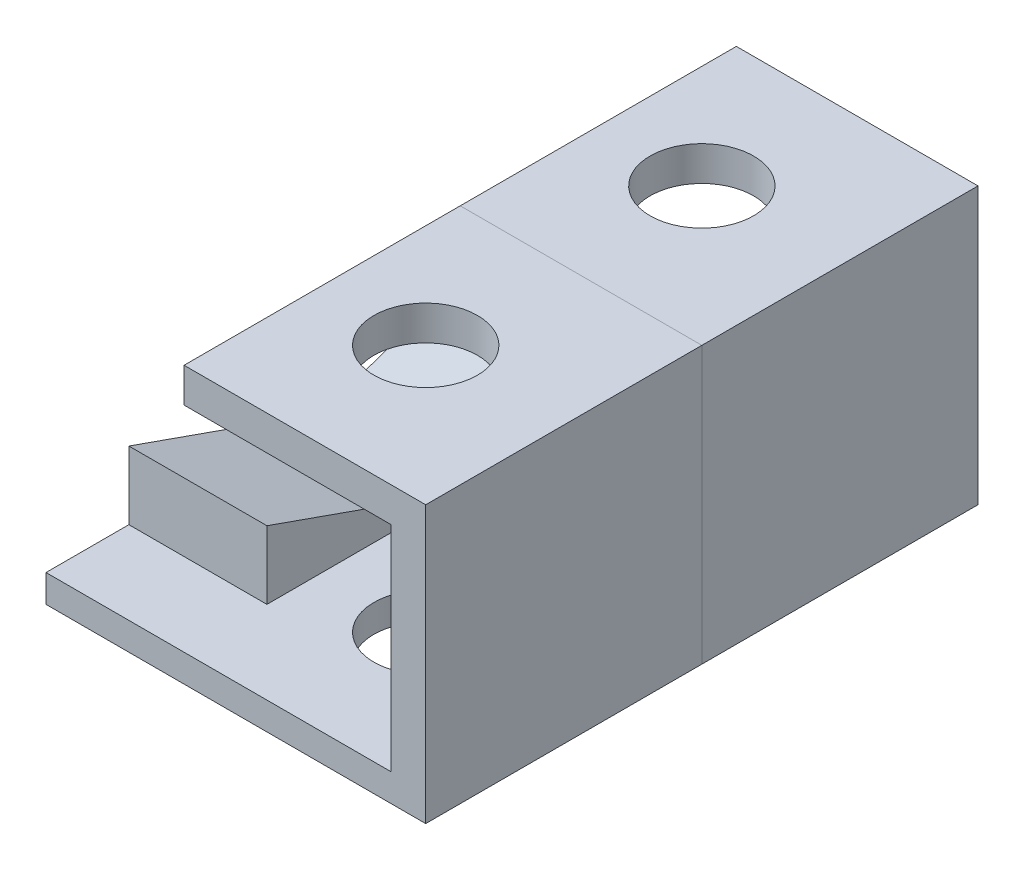
ISO-10303-21;
HEADER;
FILE_DESCRIPTION(('STEP AP214'),'2;1');
FILE_NAME('part.step','',(''),(''),'','','');
FILE_SCHEMA(('AUTOMOTIVE_DESIGN { 1 0 10303 214 1 1 1 1 }'));
ENDSEC;
DATA;
#1=APPLICATION_CONTEXT('core data for automotive mechanical design processes');
#2=APPLICATION_PROTOCOL_DEFINITION('international standard','automotive_design',2000,#1);
#3=PRODUCT_CONTEXT('',#1,'mechanical');
#4=PRODUCT('Part','Part','',(#3));
#5=PRODUCT_RELATED_PRODUCT_CATEGORY('part','',(#4));
#6=PRODUCT_DEFINITION_FORMATION('','',#4);
#7=PRODUCT_DEFINITION_CONTEXT('part definition',#1,'design');
#8=PRODUCT_DEFINITION('design','',#6,#7);
#9=PRODUCT_DEFINITION_SHAPE('','',#8);
#10=(LENGTH_UNIT() NAMED_UNIT(*) SI_UNIT(.MILLI.,.METRE.));
#11=(NAMED_UNIT(*) PLANE_ANGLE_UNIT() SI_UNIT($,.RADIAN.));
#12=(NAMED_UNIT(*) SI_UNIT($,.STERADIAN.) SOLID_ANGLE_UNIT());
#13=UNCERTAINTY_MEASURE_WITH_UNIT(LENGTH_MEASURE(1.E-05),#10,'distance_accuracy_value','');
#14=(GEOMETRIC_REPRESENTATION_CONTEXT(3) GLOBAL_UNCERTAINTY_ASSIGNED_CONTEXT((#13)) GLOBAL_UNIT_ASSIGNED_CONTEXT((#10,
#11,#12)) REPRESENTATION_CONTEXT('',''));
#15=CARTESIAN_POINT('',(0.,0.,0.));
#16=DIRECTION('',(0.,0.,1.));
#17=DIRECTION('',(1.,0.,0.));
#18=AXIS2_PLACEMENT_3D('',#15,#16,#17);
#19=CARTESIAN_POINT('',(31.75,25.4,0.));
#20=DIRECTION('',(-1.,0.,0.));
#21=DIRECTION('',(0.,0.,-1.));
#22=AXIS2_PLACEMENT_3D('',#19,#20,#21);
#23=PLANE('',#22);
#24=DIRECTION('',(0.,-1.,0.));
#25=VECTOR('',#24,1.);
#26=CARTESIAN_POINT('',(31.75,25.4,0.));
#27=LINE('',#26,#25);
#28=CARTESIAN_POINT('',(31.75,22.225,0.));
#29=VERTEX_POINT('',#28);
#30=CARTESIAN_POINT('',(31.75,2.54,0.));
#31=VERTEX_POINT('',#30);
#32=EDGE_CURVE('E215',#29,#31,#27,.T.);
#33=ORIENTED_EDGE('',*,*,#32,.T.);
#34=DIRECTION('',(0.,0.,1.));
#35=VECTOR('',#34,1.);
#36=CARTESIAN_POINT('',(31.75,2.54,0.));
#37=LINE('',#36,#35);
#38=CARTESIAN_POINT('',(31.75,2.54,25.4));
#39=VERTEX_POINT('',#38);
#40=EDGE_CURVE('E13',#31,#39,#37,.T.);
#41=ORIENTED_EDGE('',*,*,#40,.T.);
#42=DIRECTION('',(0.,-1.,0.));
#43=VECTOR('',#42,1.);
#44=CARTESIAN_POINT('',(31.75,25.4,25.4));
#45=LINE('',#44,#43);
#46=CARTESIAN_POINT('',(31.75,22.225,25.4));
#47=VERTEX_POINT('',#46);
#48=EDGE_CURVE('E218',#47,#39,#45,.T.);
#49=ORIENTED_EDGE('',*,*,#48,.F.);
#50=DIRECTION('',(0.,0.,-1.));
#51=VECTOR('',#50,1.);
#52=CARTESIAN_POINT('',(31.75,22.225,25.4));
#53=LINE('',#52,#51);
#54=EDGE_CURVE('E183',#47,#29,#53,.T.);
#55=ORIENTED_EDGE('',*,*,#54,.T.);
#56=EDGE_LOOP('',(#33,#41,#49,#55));
#57=FACE_BOUND('',#56,.T.);
#58=ADVANCED_FACE('F77',(#57),#23,.T.);
#59=CARTESIAN_POINT('',(0.,2.54,25.4));
#60=DIRECTION('',(0.,0.,1.));
#61=DIRECTION('',(-1.,0.,0.));
#62=AXIS2_PLACEMENT_3D('',#59,#60,#61);
#63=PLANE('',#62);
#64=DIRECTION('',(1.,0.,0.));
#65=VECTOR('',#64,1.);
#66=CARTESIAN_POINT('',(0.,0.,25.4));
#67=LINE('',#66,#65);
#68=CARTESIAN_POINT('',(0.,0.,25.4));
#69=VERTEX_POINT('',#68);
#70=CARTESIAN_POINT('',(34.925,0.,25.4));
#71=VERTEX_POINT('',#70);
#72=EDGE_CURVE('E237',#69,#71,#67,.T.);
#73=ORIENTED_EDGE('',*,*,#72,.T.);
#74=DIRECTION('',(0.,-1.,0.));
#75=VECTOR('',#74,1.);
#76=CARTESIAN_POINT('',(34.925,25.4,25.4));
#77=LINE('',#76,#75);
#78=CARTESIAN_POINT('',(34.925,25.4,25.4));
#79=VERTEX_POINT('',#78);
#80=EDGE_CURVE('E221',#79,#71,#77,.T.);
#81=ORIENTED_EDGE('',*,*,#80,.F.);
#82=DIRECTION('',(1.,0.,0.));
#83=VECTOR('',#82,1.);
#84=CARTESIAN_POINT('',(0.,25.4,25.4));
#85=LINE('',#84,#83);
#86=CARTESIAN_POINT('',(12.7,25.4,25.4));
#87=VERTEX_POINT('',#86);
#88=EDGE_CURVE('E205',#87,#79,#85,.T.);
#89=ORIENTED_EDGE('',*,*,#88,.F.);
#90=DIRECTION('',(0.,-1.,0.));
#91=VECTOR('',#90,1.);
#92=CARTESIAN_POINT('',(12.7,25.4,25.4));
#93=LINE('',#92,#91);
#94=CARTESIAN_POINT('',(12.7,22.225,25.4));
#95=VERTEX_POINT('',#94);
#96=EDGE_CURVE('E186',#87,#95,#93,.T.);
#97=ORIENTED_EDGE('',*,*,#96,.T.);
#98=DIRECTION('',(1.,0.,0.));
#99=VECTOR('',#98,1.);
#100=CARTESIAN_POINT('',(12.7,22.225,25.4));
#101=LINE('',#100,#99);
#102=EDGE_CURVE('E200',#95,#47,#101,.T.);
#103=ORIENTED_EDGE('',*,*,#102,.T.);
#104=ORIENTED_EDGE('',*,*,#48,.T.);
#105=DIRECTION('',(1.,0.,0.));
#106=VECTOR('',#105,1.);
#107=CARTESIAN_POINT('',(0.,2.54,25.4));
#108=LINE('',#107,#106);
#109=CARTESIAN_POINT('',(0.,2.54,25.4));
#110=VERTEX_POINT('',#109);
#111=EDGE_CURVE('E228',#110,#39,#108,.T.);
#112=ORIENTED_EDGE('',*,*,#111,.F.);
#113=DIRECTION('',(0.,-1.,0.));
#114=VECTOR('',#113,1.);
#115=CARTESIAN_POINT('',(0.,2.54,25.4));
#116=LINE('',#115,#114);
#117=EDGE_CURVE('E81',#110,#69,#116,.T.);
#118=ORIENTED_EDGE('',*,*,#117,.T.);
#119=EDGE_LOOP('',(#73,#81,#89,#97,#103,#104,#112,#118));
#120=FACE_BOUND('',#119,.T.);
#121=ADVANCED_FACE('F255',(#120),#63,.T.);
#122=CARTESIAN_POINT('',(0.,2.54,0.));
#123=DIRECTION('',(0.,0.,1.));
#124=DIRECTION('',(-1.,0.,0.));
#125=AXIS2_PLACEMENT_3D('',#122,#123,#124);
#126=PLANE('',#125);
#127=DIRECTION('',(1.,0.,0.));
#128=VECTOR('',#127,1.);
#129=CARTESIAN_POINT('',(0.,0.,0.));
#130=LINE('',#129,#128);
#131=CARTESIAN_POINT('',(0.,0.,0.));
#132=VERTEX_POINT('',#131);
#133=CARTESIAN_POINT('',(34.925,0.,0.));
#134=VERTEX_POINT('',#133);
#135=EDGE_CURVE('E229',#132,#134,#130,.T.);
#136=ORIENTED_EDGE('',*,*,#135,.F.);
#137=DIRECTION('',(0.,-1.,0.));
#138=VECTOR('',#137,1.);
#139=CARTESIAN_POINT('',(0.,2.54,0.));
#140=LINE('',#139,#138);
#141=CARTESIAN_POINT('',(0.,2.54,0.));
#142=VERTEX_POINT('',#141);
#143=EDGE_CURVE('E245',#142,#132,#140,.T.);
#144=ORIENTED_EDGE('',*,*,#143,.F.);
#145=DIRECTION('',(1.,0.,0.));
#146=VECTOR('',#145,1.);
#147=CARTESIAN_POINT('',(0.,2.54,0.));
#148=LINE('',#147,#146);
#149=CARTESIAN_POINT('',(12.7,2.54,0.));
#150=VERTEX_POINT('',#149);
#151=EDGE_CURVE('E86',#142,#150,#148,.T.);
#152=ORIENTED_EDGE('',*,*,#151,.T.);
#153=EDGE_CURVE('E231',#150,#31,#148,.T.);
#154=ORIENTED_EDGE('',*,*,#153,.T.);
#155=ORIENTED_EDGE('',*,*,#32,.F.);
#156=DIRECTION('',(1.,0.,0.));
#157=VECTOR('',#156,1.);
#158=CARTESIAN_POINT('',(12.7,22.225,0.));
#159=LINE('',#158,#157);
#160=CARTESIAN_POINT('',(12.7,22.225,0.));
#161=VERTEX_POINT('',#160);
#162=EDGE_CURVE('E196',#161,#29,#159,.T.);
#163=ORIENTED_EDGE('',*,*,#162,.F.);
#164=DIRECTION('',(0.,1.,0.));
#165=VECTOR('',#164,1.);
#166=CARTESIAN_POINT('',(12.7,25.4,0.));
#167=LINE('',#166,#165);
#168=CARTESIAN_POINT('',(12.7,25.4,0.));
#169=VERTEX_POINT('',#168);
#170=EDGE_CURVE('E191',#161,#169,#167,.T.);
#171=ORIENTED_EDGE('',*,*,#170,.T.);
#172=DIRECTION('',(1.,0.,0.));
#173=VECTOR('',#172,1.);
#174=CARTESIAN_POINT('',(0.,25.4,0.));
#175=LINE('',#174,#173);
#176=CARTESIAN_POINT('',(34.925,25.4,0.));
#177=VERTEX_POINT('',#176);
#178=EDGE_CURVE('E208',#169,#177,#175,.T.);
#179=ORIENTED_EDGE('',*,*,#178,.T.);
#180=DIRECTION('',(0.,-1.,0.));
#181=VECTOR('',#180,1.);
#182=CARTESIAN_POINT('',(34.925,25.4,0.));
#183=LINE('',#182,#181);
#184=EDGE_CURVE('E211',#177,#134,#183,.T.);
#185=ORIENTED_EDGE('',*,*,#184,.T.);
#186=EDGE_LOOP('',(#136,#144,#152,#154,#155,#163,#171,#179,#185));
#187=FACE_BOUND('',#186,.T.);
#188=ADVANCED_FACE('F284',(#187),#126,.F.);
#189=CARTESIAN_POINT('',(22.225,2.54,12.7));
#190=DIRECTION('',(0.,-1.,0.));
#191=DIRECTION('',(0.,0.,1.));
#192=AXIS2_PLACEMENT_3D('',#189,#190,#191);
#193=CYLINDRICAL_SURFACE('',#192,4.7625);
#194=CARTESIAN_POINT('',(22.225,2.54,12.7));
#195=DIRECTION('',(0.,-1.,0.));
#196=DIRECTION('',(0.,0.,-1.));
#197=AXIS2_PLACEMENT_3D('',#194,#195,#196);
#198=CIRCLE('',#197,4.7625);
#199=CARTESIAN_POINT('',(22.225,2.54,7.9375));
#200=VERTEX_POINT('',#199);
#201=EDGE_CURVE('E225',#200,#200,#198,.T.);
#202=ORIENTED_EDGE('',*,*,#201,.F.);
#203=EDGE_LOOP('',(#202));
#204=FACE_BOUND('',#203,.T.);
#205=CARTESIAN_POINT('',(22.225,0.,12.7));
#206=DIRECTION('',(0.,-1.,0.));
#207=DIRECTION('',(0.,0.,-1.));
#208=AXIS2_PLACEMENT_3D('',#205,#206,#207);
#209=CIRCLE('',#208,4.7625);
#210=CARTESIAN_POINT('',(22.225,0.,7.9375));
#211=VERTEX_POINT('',#210);
#212=EDGE_CURVE('E234',#211,#211,#209,.T.);
#213=ORIENTED_EDGE('',*,*,#212,.T.);
#214=EDGE_LOOP('',(#213));
#215=FACE_BOUND('',#214,.T.);
#216=ADVANCED_FACE('F286',(#204,#215),#193,.F.);
#217=CARTESIAN_POINT('',(0.,2.54,0.));
#218=DIRECTION('',(0.,1.,0.));
#219=DIRECTION('',(0.,0.,-1.));
#220=AXIS2_PLACEMENT_3D('',#217,#218,#219);
#221=PLANE('',#220);
#222=DIRECTION('',(-1.,0.,0.));
#223=VECTOR('',#222,1.);
#224=CARTESIAN_POINT('',(12.7,2.54,17.7786016365956));
#225=LINE('',#224,#223);
#226=CARTESIAN_POINT('',(12.7,2.54,17.7786016365956));
#227=VERTEX_POINT('',#226);
#228=CARTESIAN_POINT('',(0.,2.54,17.7786016365956));
#229=VERTEX_POINT('',#228);
#230=EDGE_CURVE('E167',#227,#229,#225,.T.);
#231=ORIENTED_EDGE('',*,*,#230,.T.);
#232=DIRECTION('',(0.,0.,-1.));
#233=VECTOR('',#232,1.);
#234=CARTESIAN_POINT('',(0.,2.54,25.4));
#235=LINE('',#234,#233);
#236=EDGE_CURVE('E242',#110,#229,#235,.T.);
#237=ORIENTED_EDGE('',*,*,#236,.F.);
#238=ORIENTED_EDGE('',*,*,#111,.T.);
#239=ORIENTED_EDGE('',*,*,#40,.F.);
#240=ORIENTED_EDGE('',*,*,#153,.F.);
#241=DIRECTION('',(0.,0.,-1.));
#242=VECTOR('',#241,1.);
#243=CARTESIAN_POINT('',(12.7,2.54,17.7786016365956));
#244=LINE('',#243,#242);
#245=EDGE_CURVE('E158',#227,#150,#244,.T.);
#246=ORIENTED_EDGE('',*,*,#245,.F.);
#247=EDGE_LOOP('',(#231,#237,#238,#239,#240,#246));
#248=FACE_BOUND('',#247,.T.);
#249=ORIENTED_EDGE('',*,*,#201,.T.);
#250=EDGE_LOOP('',(#249));
#251=FACE_BOUND('',#250,.T.);
#252=ADVANCED_FACE('F281',(#248,#251),#221,.T.);
#253=CARTESIAN_POINT('',(0.,0.,0.));
#254=DIRECTION('',(0.,1.,0.));
#255=DIRECTION('',(0.,0.,-1.));
#256=AXIS2_PLACEMENT_3D('',#253,#254,#255);
#257=PLANE('',#256);
#258=ORIENTED_EDGE('',*,*,#135,.T.);
#259=DIRECTION('',(0.,0.,-1.));
#260=VECTOR('',#259,1.);
#261=CARTESIAN_POINT('',(34.925,0.,0.));
#262=LINE('',#261,#260);
#263=EDGE_CURVE('E202',#71,#134,#262,.T.);
#264=ORIENTED_EDGE('',*,*,#263,.F.);
#265=ORIENTED_EDGE('',*,*,#72,.F.);
#266=DIRECTION('',(0.,0.,-1.));
#267=VECTOR('',#266,1.);
#268=CARTESIAN_POINT('',(0.,0.,25.4));
#269=LINE('',#268,#267);
#270=EDGE_CURVE('E224',#69,#132,#269,.T.);
#271=ORIENTED_EDGE('',*,*,#270,.T.);
#272=EDGE_LOOP('',(#258,#264,#265,#271));
#273=FACE_BOUND('',#272,.T.);
#274=ORIENTED_EDGE('',*,*,#212,.F.);
#275=EDGE_LOOP('',(#274));
#276=FACE_BOUND('',#275,.T.);
#277=ADVANCED_FACE('F258',(#273,#276),#257,.F.);
#278=CARTESIAN_POINT('',(0.,2.54,25.4));
#279=DIRECTION('',(1.,0.,0.));
#280=DIRECTION('',(0.,0.,1.));
#281=AXIS2_PLACEMENT_3D('',#278,#279,#280);
#282=PLANE('',#281);
#283=ORIENTED_EDGE('',*,*,#270,.F.);
#284=ORIENTED_EDGE('',*,*,#117,.F.);
#285=ORIENTED_EDGE('',*,*,#236,.T.);
#286=DIRECTION('',(0.,-1.,0.));
#287=VECTOR('',#286,1.);
#288=CARTESIAN_POINT('',(0.,2.54,17.7786016365956));
#289=LINE('',#288,#287);
#290=CARTESIAN_POINT('',(0.,8.80513772784752,17.7786016365956));
#291=VERTEX_POINT('',#290);
#292=EDGE_CURVE('E176',#291,#229,#289,.T.);
#293=ORIENTED_EDGE('',*,*,#292,.F.);
#294=DIRECTION('',(0.,0.332364248343034,0.943151104767084));
#295=VECTOR('',#294,1.);
#296=CARTESIAN_POINT('',(0.,8.80513772784752,17.7786016365956));
#297=LINE('',#296,#295);
#298=EDGE_CURVE('E164',#142,#291,#297,.T.);
#299=ORIENTED_EDGE('',*,*,#298,.F.);
#300=ORIENTED_EDGE('',*,*,#143,.T.);
#301=EDGE_LOOP('',(#283,#284,#285,#293,#299,#300));
#302=FACE_BOUND('',#301,.T.);
#303=ADVANCED_FACE('F79',(#302),#282,.F.);
#304=CARTESIAN_POINT('',(34.925,25.4,0.));
#305=DIRECTION('',(1.,0.,0.));
#306=DIRECTION('',(0.,0.,1.));
#307=AXIS2_PLACEMENT_3D('',#304,#305,#306);
#308=PLANE('',#307);
#309=ORIENTED_EDGE('',*,*,#263,.T.);
#310=ORIENTED_EDGE('',*,*,#184,.F.);
#311=DIRECTION('',(0.,0.,-1.));
#312=VECTOR('',#311,1.);
#313=CARTESIAN_POINT('',(34.925,25.4,0.));
#314=LINE('',#313,#312);
#315=EDGE_CURVE('E203',#79,#177,#314,.T.);
#316=ORIENTED_EDGE('',*,*,#315,.F.);
#317=ORIENTED_EDGE('',*,*,#80,.T.);
#318=EDGE_LOOP('',(#309,#310,#316,#317));
#319=FACE_BOUND('',#318,.T.);
#320=ADVANCED_FACE('F262',(#319),#308,.T.);
#321=CARTESIAN_POINT('',(0.,25.4,0.));
#322=DIRECTION('',(0.,1.,0.));
#323=DIRECTION('',(0.,0.,-1.));
#324=AXIS2_PLACEMENT_3D('',#321,#322,#323);
#325=PLANE('',#324);
#326=CARTESIAN_POINT('',(22.225,25.4,12.7));
#327=DIRECTION('',(0.,-1.,0.));
#328=DIRECTION('',(0.,0.,-1.));
#329=AXIS2_PLACEMENT_3D('',#326,#327,#328);
#330=CIRCLE('',#329,4.7625);
#331=CARTESIAN_POINT('',(22.225,25.4,7.9375));
#332=VERTEX_POINT('',#331);
#333=EDGE_CURVE('E178',#332,#332,#330,.T.);
#334=ORIENTED_EDGE('',*,*,#333,.T.);
#335=EDGE_LOOP('',(#334));
#336=FACE_BOUND('',#335,.T.);
#337=ORIENTED_EDGE('',*,*,#315,.T.);
#338=ORIENTED_EDGE('',*,*,#178,.F.);
#339=DIRECTION('',(0.,0.,1.));
#340=VECTOR('',#339,1.);
#341=CARTESIAN_POINT('',(12.7,25.4,25.4));
#342=LINE('',#341,#340);
#343=EDGE_CURVE('E194',#169,#87,#342,.T.);
#344=ORIENTED_EDGE('',*,*,#343,.T.);
#345=ORIENTED_EDGE('',*,*,#88,.T.);
#346=EDGE_LOOP('',(#337,#338,#344,#345));
#347=FACE_BOUND('',#346,.T.);
#348=ADVANCED_FACE('F266',(#336,#347),#325,.T.);
#349=CARTESIAN_POINT('',(12.7,22.225,25.4));
#350=DIRECTION('',(0.,1.,0.));
#351=DIRECTION('',(0.,0.,-1.));
#352=AXIS2_PLACEMENT_3D('',#349,#350,#351);
#353=PLANE('',#352);
#354=CARTESIAN_POINT('',(22.225,22.225,12.7));
#355=DIRECTION('',(0.,-1.,0.));
#356=DIRECTION('',(0.,0.,-1.));
#357=AXIS2_PLACEMENT_3D('',#354,#355,#356);
#358=CIRCLE('',#357,4.7625);
#359=CARTESIAN_POINT('',(22.225,22.225,7.9375));
#360=VERTEX_POINT('',#359);
#361=EDGE_CURVE('E180',#360,#360,#358,.T.);
#362=ORIENTED_EDGE('',*,*,#361,.F.);
#363=EDGE_LOOP('',(#362));
#364=FACE_BOUND('',#363,.T.);
#365=ORIENTED_EDGE('',*,*,#54,.F.);
#366=ORIENTED_EDGE('',*,*,#102,.F.);
#367=DIRECTION('',(0.,0.,-1.));
#368=VECTOR('',#367,1.);
#369=CARTESIAN_POINT('',(12.7,22.225,25.4));
#370=LINE('',#369,#368);
#371=EDGE_CURVE('E189',#95,#161,#370,.T.);
#372=ORIENTED_EDGE('',*,*,#371,.T.);
#373=ORIENTED_EDGE('',*,*,#162,.T.);
#374=EDGE_LOOP('',(#365,#366,#372,#373));
#375=FACE_BOUND('',#374,.T.);
#376=ADVANCED_FACE('F275',(#364,#375),#353,.F.);
#377=CARTESIAN_POINT('',(12.7,0.,0.));
#378=DIRECTION('',(-1.,0.,0.));
#379=DIRECTION('',(0.,0.,-1.));
#380=AXIS2_PLACEMENT_3D('',#377,#378,#379);
#381=PLANE('',#380);
#382=ORIENTED_EDGE('',*,*,#96,.F.);
#383=ORIENTED_EDGE('',*,*,#343,.F.);
#384=ORIENTED_EDGE('',*,*,#170,.F.);
#385=ORIENTED_EDGE('',*,*,#371,.F.);
#386=EDGE_LOOP('',(#382,#383,#384,#385));
#387=FACE_BOUND('',#386,.T.);
#388=ADVANCED_FACE('F270',(#387),#381,.T.);
#389=CARTESIAN_POINT('',(22.225,22.225,12.7));
#390=DIRECTION('',(0.,1.,0.));
#391=DIRECTION('',(0.,0.,-1.));
#392=AXIS2_PLACEMENT_3D('',#389,#390,#391);
#393=CYLINDRICAL_SURFACE('',#392,4.7625);
#394=ORIENTED_EDGE('',*,*,#361,.T.);
#395=EDGE_LOOP('',(#394));
#396=FACE_BOUND('',#395,.T.);
#397=ORIENTED_EDGE('',*,*,#333,.F.);
#398=EDGE_LOOP('',(#397));
#399=FACE_BOUND('',#398,.T.);
#400=ADVANCED_FACE('F333',(#396,#399),#393,.F.);
#401=CARTESIAN_POINT('',(12.7,2.54,17.7786016365956));
#402=DIRECTION('',(0.,0.,1.));
#403=DIRECTION('',(-1.,0.,0.));
#404=AXIS2_PLACEMENT_3D('',#401,#402,#403);
#405=PLANE('',#404);
#406=ORIENTED_EDGE('',*,*,#292,.T.);
#407=ORIENTED_EDGE('',*,*,#230,.F.);
#408=DIRECTION('',(0.,-1.,0.));
#409=VECTOR('',#408,1.);
#410=CARTESIAN_POINT('',(12.7,2.54,17.7786016365956));
#411=LINE('',#410,#409);
#412=CARTESIAN_POINT('',(12.7,8.80513772784752,17.7786016365956));
#413=VERTEX_POINT('',#412);
#414=EDGE_CURVE('E94',#413,#227,#411,.T.);
#415=ORIENTED_EDGE('',*,*,#414,.F.);
#416=DIRECTION('',(-1.,0.,0.));
#417=VECTOR('',#416,1.);
#418=CARTESIAN_POINT('',(12.7,8.80513772784752,17.7786016365956));
#419=LINE('',#418,#417);
#420=EDGE_CURVE('E162',#413,#291,#419,.T.);
#421=ORIENTED_EDGE('',*,*,#420,.T.);
#422=EDGE_LOOP('',(#406,#407,#415,#421));
#423=FACE_BOUND('',#422,.T.);
#424=ADVANCED_FACE('F170',(#423),#405,.T.);
#425=CARTESIAN_POINT('',(12.7,8.80513772784752,17.7786016365956));
#426=DIRECTION('',(0.,0.943151104767084,-0.332364248343034));
#427=DIRECTION('',(0.,-0.332364248343034,-0.943151104767084));
#428=AXIS2_PLACEMENT_3D('',#425,#426,#427);
#429=PLANE('',#428);
#430=ORIENTED_EDGE('',*,*,#298,.T.);
#431=ORIENTED_EDGE('',*,*,#420,.F.);
#432=DIRECTION('',(0.,0.332364248343034,0.943151104767084));
#433=VECTOR('',#432,1.);
#434=CARTESIAN_POINT('',(12.7,8.80513772784752,17.7786016365956));
#435=LINE('',#434,#433);
#436=EDGE_CURVE('E101',#150,#413,#435,.T.);
#437=ORIENTED_EDGE('',*,*,#436,.F.);
#438=ORIENTED_EDGE('',*,*,#151,.F.);
#439=EDGE_LOOP('',(#430,#431,#437,#438));
#440=FACE_BOUND('',#439,.T.);
#441=ADVANCED_FACE('F163',(#440),#429,.T.);
#442=CARTESIAN_POINT('',(12.7,0.,0.));
#443=DIRECTION('',(-1.,0.,0.));
#444=DIRECTION('',(0.,0.,-1.));
#445=AXIS2_PLACEMENT_3D('',#442,#443,#444);
#446=PLANE('',#445);
#447=ORIENTED_EDGE('',*,*,#245,.T.);
#448=ORIENTED_EDGE('',*,*,#436,.T.);
#449=ORIENTED_EDGE('',*,*,#414,.T.);
#450=EDGE_LOOP('',(#447,#448,#449));
#451=FACE_BOUND('',#450,.T.);
#452=ADVANCED_FACE('F157',(#451),#446,.F.);
#453=CLOSED_SHELL('',(#58,#121,#188,#216,#252,#277,#303,#320,#348,#376,#388,#400,#424,#441,#452));
#454=MANIFOLD_SOLID_BREP('B2',#453);
#455=CARTESIAN_POINT('',(31.75,25.4,0.));
#456=DIRECTION('',(-1.,0.,0.));
#457=DIRECTION('',(0.,0.,1.));
#458=AXIS2_PLACEMENT_3D('',#455,#456,#457);
#459=PLANE('',#458);
#460=DIRECTION('',(0.,-1.,0.));
#461=VECTOR('',#460,1.);
#462=CARTESIAN_POINT('',(31.75,25.4,0.));
#463=LINE('',#462,#461);
#464=CARTESIAN_POINT('',(31.75,22.225,0.));
#465=VERTEX_POINT('',#464);
#466=CARTESIAN_POINT('',(31.75,2.54,0.));
#467=VERTEX_POINT('',#466);
#468=EDGE_CURVE('E615',#465,#467,#463,.T.);
#469=ORIENTED_EDGE('',*,*,#468,.F.);
#470=DIRECTION('',(0.,0.,1.));
#471=VECTOR('',#470,1.);
#472=CARTESIAN_POINT('',(31.75,22.225,-25.4));
#473=LINE('',#472,#471);
#474=CARTESIAN_POINT('',(31.75,22.225,-25.4));
#475=VERTEX_POINT('',#474);
#476=EDGE_CURVE('E566',#475,#465,#473,.T.);
#477=ORIENTED_EDGE('',*,*,#476,.F.);
#478=DIRECTION('',(0.,-1.,0.));
#479=VECTOR('',#478,1.);
#480=CARTESIAN_POINT('',(31.75,25.4,-25.4));
#481=LINE('',#480,#479);
#482=CARTESIAN_POINT('',(31.75,2.54,-25.4));
#483=VERTEX_POINT('',#482);
#484=EDGE_CURVE('E619',#475,#483,#481,.T.);
#485=ORIENTED_EDGE('',*,*,#484,.T.);
#486=DIRECTION('',(0.,0.,-1.));
#487=VECTOR('',#486,1.);
#488=CARTESIAN_POINT('',(31.75,2.54,0.));
#489=LINE('',#488,#487);
#490=EDGE_CURVE('E75',#467,#483,#489,.T.);
#491=ORIENTED_EDGE('',*,*,#490,.F.);
#492=EDGE_LOOP('',(#469,#477,#485,#491));
#493=FACE_BOUND('',#492,.T.);
#494=ADVANCED_FACE('F448',(#493),#459,.T.);
#495=CARTESIAN_POINT('',(0.,2.54,-25.4));
#496=DIRECTION('',(0.,0.,-1.));
#497=DIRECTION('',(-1.,0.,0.));
#498=AXIS2_PLACEMENT_3D('',#495,#496,#497);
#499=PLANE('',#498);
#500=DIRECTION('',(1.,0.,0.));
#501=VECTOR('',#500,1.);
#502=CARTESIAN_POINT('',(0.,0.,-25.4));
#503=LINE('',#502,#501);
#504=CARTESIAN_POINT('',(0.,0.,-25.4));
#505=VERTEX_POINT('',#504);
#506=CARTESIAN_POINT('',(34.925,0.,-25.4));
#507=VERTEX_POINT('',#506);
#508=EDGE_CURVE('E643',#505,#507,#503,.T.);
#509=ORIENTED_EDGE('',*,*,#508,.F.);
#510=DIRECTION('',(0.,-1.,0.));
#511=VECTOR('',#510,1.);
#512=CARTESIAN_POINT('',(0.,2.54,-25.4));
#513=LINE('',#512,#511);
#514=CARTESIAN_POINT('',(0.,2.54,-25.4));
#515=VERTEX_POINT('',#514);
#516=EDGE_CURVE('E452',#515,#505,#513,.T.);
#517=ORIENTED_EDGE('',*,*,#516,.F.);
#518=DIRECTION('',(1.,0.,0.));
#519=VECTOR('',#518,1.);
#520=CARTESIAN_POINT('',(0.,2.54,-25.4));
#521=LINE('',#520,#519);
#522=EDGE_CURVE('E631',#515,#483,#521,.T.);
#523=ORIENTED_EDGE('',*,*,#522,.T.);
#524=ORIENTED_EDGE('',*,*,#484,.F.);
#525=DIRECTION('',(1.,0.,0.));
#526=VECTOR('',#525,1.);
#527=CARTESIAN_POINT('',(12.7,22.225,-25.4));
#528=LINE('',#527,#526);
#529=CARTESIAN_POINT('',(12.7,22.225,-25.4));
#530=VERTEX_POINT('',#529);
#531=EDGE_CURVE('E592',#530,#475,#528,.T.);
#532=ORIENTED_EDGE('',*,*,#531,.F.);
#533=DIRECTION('',(0.,-1.,0.));
#534=VECTOR('',#533,1.);
#535=CARTESIAN_POINT('',(12.7,25.4,-25.4));
#536=LINE('',#535,#534);
#537=CARTESIAN_POINT('',(12.7,25.4,-25.4));
#538=VERTEX_POINT('',#537);
#539=EDGE_CURVE('E570',#538,#530,#536,.T.);
#540=ORIENTED_EDGE('',*,*,#539,.F.);
#541=DIRECTION('',(1.,0.,0.));
#542=VECTOR('',#541,1.);
#543=CARTESIAN_POINT('',(0.,25.4,-25.4));
#544=LINE('',#543,#542);
#545=CARTESIAN_POINT('',(34.925,25.4,-25.4));
#546=VERTEX_POINT('',#545);
#547=EDGE_CURVE('E601',#538,#546,#544,.T.);
#548=ORIENTED_EDGE('',*,*,#547,.T.);
#549=DIRECTION('',(0.,-1.,0.));
#550=VECTOR('',#549,1.);
#551=CARTESIAN_POINT('',(34.925,25.4,-25.4));
#552=LINE('',#551,#550);
#553=EDGE_CURVE('E622',#546,#507,#552,.T.);
#554=ORIENTED_EDGE('',*,*,#553,.T.);
#555=EDGE_LOOP('',(#509,#517,#523,#524,#532,#540,#548,#554));
#556=FACE_BOUND('',#555,.T.);
#557=ADVANCED_FACE('F677',(#556),#499,.T.);
#558=CARTESIAN_POINT('',(0.,2.54,0.));
#559=DIRECTION('',(0.,0.,-1.));
#560=DIRECTION('',(-1.,0.,0.));
#561=AXIS2_PLACEMENT_3D('',#558,#559,#560);
#562=PLANE('',#561);
#563=DIRECTION('',(1.,0.,0.));
#564=VECTOR('',#563,1.);
#565=CARTESIAN_POINT('',(0.,0.,0.));
#566=LINE('',#565,#564);
#567=CARTESIAN_POINT('',(0.,0.,0.));
#568=VERTEX_POINT('',#567);
#569=CARTESIAN_POINT('',(34.925,0.,0.));
#570=VERTEX_POINT('',#569);
#571=EDGE_CURVE('E632',#568,#570,#566,.T.);
#572=ORIENTED_EDGE('',*,*,#571,.T.);
#573=DIRECTION('',(0.,-1.,0.));
#574=VECTOR('',#573,1.);
#575=CARTESIAN_POINT('',(34.925,25.4,0.));
#576=LINE('',#575,#574);
#577=CARTESIAN_POINT('',(34.925,25.4,0.));
#578=VERTEX_POINT('',#577);
#579=EDGE_CURVE('E608',#578,#570,#576,.T.);
#580=ORIENTED_EDGE('',*,*,#579,.F.);
#581=DIRECTION('',(1.,0.,0.));
#582=VECTOR('',#581,1.);
#583=CARTESIAN_POINT('',(0.,25.4,0.));
#584=LINE('',#583,#582);
#585=CARTESIAN_POINT('',(12.7,25.4,0.));
#586=VERTEX_POINT('',#585);
#587=EDGE_CURVE('E605',#586,#578,#584,.T.);
#588=ORIENTED_EDGE('',*,*,#587,.F.);
#589=DIRECTION('',(0.,1.,0.));
#590=VECTOR('',#589,1.);
#591=CARTESIAN_POINT('',(12.7,25.4,0.));
#592=LINE('',#591,#590);
#593=CARTESIAN_POINT('',(12.7,22.225,0.));
#594=VERTEX_POINT('',#593);
#595=EDGE_CURVE('E577',#594,#586,#592,.T.);
#596=ORIENTED_EDGE('',*,*,#595,.F.);
#597=DIRECTION('',(1.,0.,0.));
#598=VECTOR('',#597,1.);
#599=CARTESIAN_POINT('',(12.7,22.225,0.));
#600=LINE('',#599,#598);
#601=EDGE_CURVE('E585',#594,#465,#600,.T.);
#602=ORIENTED_EDGE('',*,*,#601,.T.);
#603=ORIENTED_EDGE('',*,*,#468,.T.);
#604=DIRECTION('',(1.,0.,0.));
#605=VECTOR('',#604,1.);
#606=CARTESIAN_POINT('',(0.,2.54,0.));
#607=LINE('',#606,#605);
#608=CARTESIAN_POINT('',(12.7,2.54,0.));
#609=VERTEX_POINT('',#608);
#610=EDGE_CURVE('E636',#609,#467,#607,.T.);
#611=ORIENTED_EDGE('',*,*,#610,.F.);
#612=CARTESIAN_POINT('',(0.,2.54,0.));
#613=VERTEX_POINT('',#612);
#614=EDGE_CURVE('E458',#613,#609,#607,.T.);
#615=ORIENTED_EDGE('',*,*,#614,.F.);
#616=DIRECTION('',(0.,-1.,0.));
#617=VECTOR('',#616,1.);
#618=CARTESIAN_POINT('',(0.,2.54,0.));
#619=LINE('',#618,#617);
#620=EDGE_CURVE('E651',#613,#568,#619,.T.);
#621=ORIENTED_EDGE('',*,*,#620,.T.);
#622=EDGE_LOOP('',(#572,#580,#588,#596,#602,#603,#611,#615,#621));
#623=FACE_BOUND('',#622,.T.);
#624=ADVANCED_FACE('F669',(#623),#562,.F.);
#625=CARTESIAN_POINT('',(22.225,2.54,-12.7));
#626=DIRECTION('',(0.,-1.,0.));
#627=DIRECTION('',(0.,0.,-1.));
#628=AXIS2_PLACEMENT_3D('',#625,#626,#627);
#629=CYLINDRICAL_SURFACE('',#628,4.7625);
#630=CARTESIAN_POINT('',(22.225,2.54,-12.7));
#631=DIRECTION('',(0.,1.,0.));
#632=DIRECTION('',(0.,0.,1.));
#633=AXIS2_PLACEMENT_3D('',#630,#631,#632);
#634=CIRCLE('',#633,4.7625);
#635=CARTESIAN_POINT('',(22.225,2.54,-7.9375));
#636=VERTEX_POINT('',#635);
#637=EDGE_CURVE('E627',#636,#636,#634,.T.);
#638=ORIENTED_EDGE('',*,*,#637,.T.);
#639=EDGE_LOOP('',(#638));
#640=FACE_BOUND('',#639,.T.);
#641=CARTESIAN_POINT('',(22.225,0.,-12.7));
#642=DIRECTION('',(0.,1.,0.));
#643=DIRECTION('',(0.,0.,1.));
#644=AXIS2_PLACEMENT_3D('',#641,#642,#643);
#645=CIRCLE('',#644,4.7625);
#646=CARTESIAN_POINT('',(22.225,0.,-7.9375));
#647=VERTEX_POINT('',#646);
#648=EDGE_CURVE('E639',#647,#647,#645,.T.);
#649=ORIENTED_EDGE('',*,*,#648,.F.);
#650=EDGE_LOOP('',(#649));
#651=FACE_BOUND('',#650,.T.);
#652=ADVANCED_FACE('F692',(#640,#651),#629,.F.);
#653=CARTESIAN_POINT('',(0.,2.54,0.));
#654=DIRECTION('',(0.,1.,0.));
#655=DIRECTION('',(0.,0.,1.));
#656=AXIS2_PLACEMENT_3D('',#653,#654,#655);
#657=PLANE('',#656);
#658=DIRECTION('',(-1.,0.,0.));
#659=VECTOR('',#658,1.);
#660=CARTESIAN_POINT('',(12.7,2.54,-17.7786016365956));
#661=LINE('',#660,#659);
#662=CARTESIAN_POINT('',(12.7,2.54,-17.7786016365956));
#663=VERTEX_POINT('',#662);
#664=CARTESIAN_POINT('',(0.,2.54,-17.7786016365956));
#665=VERTEX_POINT('',#664);
#666=EDGE_CURVE('E466',#663,#665,#661,.T.);
#667=ORIENTED_EDGE('',*,*,#666,.F.);
#668=DIRECTION('',(0.,0.,1.));
#669=VECTOR('',#668,1.);
#670=CARTESIAN_POINT('',(12.7,2.54,-17.7786016365956));
#671=LINE('',#670,#669);
#672=EDGE_CURVE('E470',#663,#609,#671,.T.);
#673=ORIENTED_EDGE('',*,*,#672,.T.);
#674=ORIENTED_EDGE('',*,*,#610,.T.);
#675=ORIENTED_EDGE('',*,*,#490,.T.);
#676=ORIENTED_EDGE('',*,*,#522,.F.);
#677=DIRECTION('',(0.,0.,1.));
#678=VECTOR('',#677,1.);
#679=CARTESIAN_POINT('',(0.,2.54,-25.4));
#680=LINE('',#679,#678);
#681=EDGE_CURVE('E648',#515,#665,#680,.T.);
#682=ORIENTED_EDGE('',*,*,#681,.T.);
#683=EDGE_LOOP('',(#667,#673,#674,#675,#676,#682));
#684=FACE_BOUND('',#683,.T.);
#685=ORIENTED_EDGE('',*,*,#637,.F.);
#686=EDGE_LOOP('',(#685));
#687=FACE_BOUND('',#686,.T.);
#688=ADVANCED_FACE('F688',(#684,#687),#657,.T.);
#689=CARTESIAN_POINT('',(0.,0.,0.));
#690=DIRECTION('',(0.,1.,0.));
#691=DIRECTION('',(0.,0.,1.));
#692=AXIS2_PLACEMENT_3D('',#689,#690,#691);
#693=PLANE('',#692);
#694=ORIENTED_EDGE('',*,*,#571,.F.);
#695=DIRECTION('',(0.,0.,1.));
#696=VECTOR('',#695,1.);
#697=CARTESIAN_POINT('',(0.,0.,-25.4));
#698=LINE('',#697,#696);
#699=EDGE_CURVE('E626',#505,#568,#698,.T.);
#700=ORIENTED_EDGE('',*,*,#699,.F.);
#701=ORIENTED_EDGE('',*,*,#508,.T.);
#702=DIRECTION('',(0.,0.,1.));
#703=VECTOR('',#702,1.);
#704=CARTESIAN_POINT('',(34.925,0.,0.));
#705=LINE('',#704,#703);
#706=EDGE_CURVE('E596',#507,#570,#705,.T.);
#707=ORIENTED_EDGE('',*,*,#706,.T.);
#708=EDGE_LOOP('',(#694,#700,#701,#707));
#709=FACE_BOUND('',#708,.T.);
#710=ORIENTED_EDGE('',*,*,#648,.T.);
#711=EDGE_LOOP('',(#710));
#712=FACE_BOUND('',#711,.T.);
#713=ADVANCED_FACE('F665',(#709,#712),#693,.F.);
#714=CARTESIAN_POINT('',(0.,2.54,-25.4));
#715=DIRECTION('',(1.,0.,0.));
#716=DIRECTION('',(0.,0.,-1.));
#717=AXIS2_PLACEMENT_3D('',#714,#715,#716);
#718=PLANE('',#717);
#719=ORIENTED_EDGE('',*,*,#699,.T.);
#720=ORIENTED_EDGE('',*,*,#620,.F.);
#721=DIRECTION('',(0.,0.332364248343034,-0.943151104767084));
#722=VECTOR('',#721,1.);
#723=CARTESIAN_POINT('',(0.,8.80513772784752,-17.7786016365956));
#724=LINE('',#723,#722);
#725=CARTESIAN_POINT('',(0.,8.80513772784752,-17.7786016365956));
#726=VERTEX_POINT('',#725);
#727=EDGE_CURVE('E554',#613,#726,#724,.T.);
#728=ORIENTED_EDGE('',*,*,#727,.T.);
#729=DIRECTION('',(0.,-1.,0.));
#730=VECTOR('',#729,1.);
#731=CARTESIAN_POINT('',(0.,2.54,-17.7786016365956));
#732=LINE('',#731,#730);
#733=EDGE_CURVE('E535',#726,#665,#732,.T.);
#734=ORIENTED_EDGE('',*,*,#733,.T.);
#735=ORIENTED_EDGE('',*,*,#681,.F.);
#736=ORIENTED_EDGE('',*,*,#516,.T.);
#737=EDGE_LOOP('',(#719,#720,#728,#734,#735,#736));
#738=FACE_BOUND('',#737,.T.);
#739=ADVANCED_FACE('F450',(#738),#718,.F.);
#740=CARTESIAN_POINT('',(34.925,25.4,0.));
#741=DIRECTION('',(1.,0.,0.));
#742=DIRECTION('',(0.,0.,-1.));
#743=AXIS2_PLACEMENT_3D('',#740,#741,#742);
#744=PLANE('',#743);
#745=ORIENTED_EDGE('',*,*,#706,.F.);
#746=ORIENTED_EDGE('',*,*,#553,.F.);
#747=DIRECTION('',(0.,0.,1.));
#748=VECTOR('',#747,1.);
#749=CARTESIAN_POINT('',(34.925,25.4,0.));
#750=LINE('',#749,#748);
#751=EDGE_CURVE('E597',#546,#578,#750,.T.);
#752=ORIENTED_EDGE('',*,*,#751,.T.);
#753=ORIENTED_EDGE('',*,*,#579,.T.);
#754=EDGE_LOOP('',(#745,#746,#752,#753));
#755=FACE_BOUND('',#754,.T.);
#756=ADVANCED_FACE('F671',(#755),#744,.T.);
#757=CARTESIAN_POINT('',(0.,25.4,0.));
#758=DIRECTION('',(0.,1.,0.));
#759=DIRECTION('',(0.,0.,1.));
#760=AXIS2_PLACEMENT_3D('',#757,#758,#759);
#761=PLANE('',#760);
#762=CARTESIAN_POINT('',(22.225,25.4,-12.7));
#763=DIRECTION('',(0.,1.,0.));
#764=DIRECTION('',(0.,0.,1.));
#765=AXIS2_PLACEMENT_3D('',#762,#763,#764);
#766=CIRCLE('',#765,4.7625);
#767=CARTESIAN_POINT('',(22.225,25.4,-7.9375));
#768=VERTEX_POINT('',#767);
#769=EDGE_CURVE('E560',#768,#768,#766,.T.);
#770=ORIENTED_EDGE('',*,*,#769,.F.);
#771=EDGE_LOOP('',(#770));
#772=FACE_BOUND('',#771,.T.);
#773=ORIENTED_EDGE('',*,*,#751,.F.);
#774=ORIENTED_EDGE('',*,*,#547,.F.);
#775=DIRECTION('',(0.,0.,-1.));
#776=VECTOR('',#775,1.);
#777=CARTESIAN_POINT('',(12.7,25.4,-25.4));
#778=LINE('',#777,#776);
#779=EDGE_CURVE('E581',#586,#538,#778,.T.);
#780=ORIENTED_EDGE('',*,*,#779,.F.);
#781=ORIENTED_EDGE('',*,*,#587,.T.);
#782=EDGE_LOOP('',(#773,#774,#780,#781));
#783=FACE_BOUND('',#782,.T.);
#784=ADVANCED_FACE('F674',(#772,#783),#761,.T.);
#785=CARTESIAN_POINT('',(12.7,22.225,-25.4));
#786=DIRECTION('',(0.,1.,0.));
#787=DIRECTION('',(0.,0.,1.));
#788=AXIS2_PLACEMENT_3D('',#785,#786,#787);
#789=PLANE('',#788);
#790=CARTESIAN_POINT('',(22.225,22.225,-12.7));
#791=DIRECTION('',(0.,1.,0.));
#792=DIRECTION('',(0.,0.,1.));
#793=AXIS2_PLACEMENT_3D('',#790,#791,#792);
#794=CIRCLE('',#793,4.7625);
#795=CARTESIAN_POINT('',(22.225,22.225,-7.9375));
#796=VERTEX_POINT('',#795);
#797=EDGE_CURVE('E562',#796,#796,#794,.T.);
#798=ORIENTED_EDGE('',*,*,#797,.T.);
#799=EDGE_LOOP('',(#798));
#800=FACE_BOUND('',#799,.T.);
#801=ORIENTED_EDGE('',*,*,#476,.T.);
#802=ORIENTED_EDGE('',*,*,#601,.F.);
#803=DIRECTION('',(0.,0.,1.));
#804=VECTOR('',#803,1.);
#805=CARTESIAN_POINT('',(12.7,22.225,-25.4));
#806=LINE('',#805,#804);
#807=EDGE_CURVE('E574',#530,#594,#806,.T.);
#808=ORIENTED_EDGE('',*,*,#807,.F.);
#809=ORIENTED_EDGE('',*,*,#531,.T.);
#810=EDGE_LOOP('',(#801,#802,#808,#809));
#811=FACE_BOUND('',#810,.T.);
#812=ADVANCED_FACE('F686',(#800,#811),#789,.F.);
#813=CARTESIAN_POINT('',(12.7,0.,0.));
#814=DIRECTION('',(-1.,0.,0.));
#815=DIRECTION('',(0.,0.,1.));
#816=AXIS2_PLACEMENT_3D('',#813,#814,#815);
#817=PLANE('',#816);
#818=ORIENTED_EDGE('',*,*,#539,.T.);
#819=ORIENTED_EDGE('',*,*,#807,.T.);
#820=ORIENTED_EDGE('',*,*,#595,.T.);
#821=ORIENTED_EDGE('',*,*,#779,.T.);
#822=EDGE_LOOP('',(#818,#819,#820,#821));
#823=FACE_BOUND('',#822,.T.);
#824=ADVANCED_FACE('F681',(#823),#817,.T.);
#825=CARTESIAN_POINT('',(22.225,22.225,-12.7));
#826=DIRECTION('',(0.,1.,0.));
#827=DIRECTION('',(0.,0.,1.));
#828=AXIS2_PLACEMENT_3D('',#825,#826,#827);
#829=CYLINDRICAL_SURFACE('',#828,4.7625);
#830=ORIENTED_EDGE('',*,*,#797,.F.);
#831=EDGE_LOOP('',(#830));
#832=FACE_BOUND('',#831,.T.);
#833=ORIENTED_EDGE('',*,*,#769,.T.);
#834=EDGE_LOOP('',(#833));
#835=FACE_BOUND('',#834,.T.);
#836=ADVANCED_FACE('F722',(#832,#835),#829,.F.);
#837=CARTESIAN_POINT('',(12.7,2.54,-17.7786016365956));
#838=DIRECTION('',(0.,0.,-1.));
#839=DIRECTION('',(-1.,0.,0.));
#840=AXIS2_PLACEMENT_3D('',#837,#838,#839);
#841=PLANE('',#840);
#842=ORIENTED_EDGE('',*,*,#733,.F.);
#843=DIRECTION('',(-1.,0.,0.));
#844=VECTOR('',#843,1.);
#845=CARTESIAN_POINT('',(12.7,8.80513772784752,-17.7786016365956));
#846=LINE('',#845,#844);
#847=CARTESIAN_POINT('',(12.7,8.80513772784752,-17.7786016365956));
#848=VERTEX_POINT('',#847);
#849=EDGE_CURVE('E529',#848,#726,#846,.T.);
#850=ORIENTED_EDGE('',*,*,#849,.F.);
#851=DIRECTION('',(0.,-1.,0.));
#852=VECTOR('',#851,1.);
#853=CARTESIAN_POINT('',(12.7,2.54,-17.7786016365956));
#854=LINE('',#853,#852);
#855=EDGE_CURVE('E533',#848,#663,#854,.T.);
#856=ORIENTED_EDGE('',*,*,#855,.T.);
#857=ORIENTED_EDGE('',*,*,#666,.T.);
#858=EDGE_LOOP('',(#842,#850,#856,#857));
#859=FACE_BOUND('',#858,.T.);
#860=ADVANCED_FACE('F531',(#859),#841,.T.);
#861=CARTESIAN_POINT('',(12.7,8.80513772784752,-17.7786016365956));
#862=DIRECTION('',(0.,0.943151104767084,0.332364248343034));
#863=DIRECTION('',(0.,-0.332364248343034,0.943151104767084));
#864=AXIS2_PLACEMENT_3D('',#861,#862,#863);
#865=PLANE('',#864);
#866=ORIENTED_EDGE('',*,*,#727,.F.);
#867=ORIENTED_EDGE('',*,*,#614,.T.);
#868=DIRECTION('',(0.,0.332364248343034,-0.943151104767084));
#869=VECTOR('',#868,1.);
#870=CARTESIAN_POINT('',(12.7,8.80513772784752,-17.7786016365956));
#871=LINE('',#870,#869);
#872=EDGE_CURVE('E543',#609,#848,#871,.T.);
#873=ORIENTED_EDGE('',*,*,#872,.T.);
#874=ORIENTED_EDGE('',*,*,#849,.T.);
#875=EDGE_LOOP('',(#866,#867,#873,#874));
#876=FACE_BOUND('',#875,.T.);
#877=ADVANCED_FACE('F544',(#876),#865,.T.);
#878=CARTESIAN_POINT('',(12.7,0.,0.));
#879=DIRECTION('',(-1.,0.,0.));
#880=DIRECTION('',(0.,0.,1.));
#881=AXIS2_PLACEMENT_3D('',#878,#879,#880);
#882=PLANE('',#881);
#883=ORIENTED_EDGE('',*,*,#672,.F.);
#884=ORIENTED_EDGE('',*,*,#855,.F.);
#885=ORIENTED_EDGE('',*,*,#872,.F.);
#886=EDGE_LOOP('',(#883,#884,#885));
#887=FACE_BOUND('',#886,.T.);
#888=ADVANCED_FACE('F549',(#887),#882,.F.);
#889=CLOSED_SHELL('',(#494,#557,#624,#652,#688,#713,#739,#756,#784,#812,#824,#836,#860,#877,#888));
#890=MANIFOLD_SOLID_BREP('B7_NOT_SHOWN',#889);
#891=ADVANCED_BREP_SHAPE_REPRESENTATION('',(#18,#454,#890),#14);
#892=SHAPE_DEFINITION_REPRESENTATION(#9,#891);
ENDSEC;
END-ISO-10303-21;
